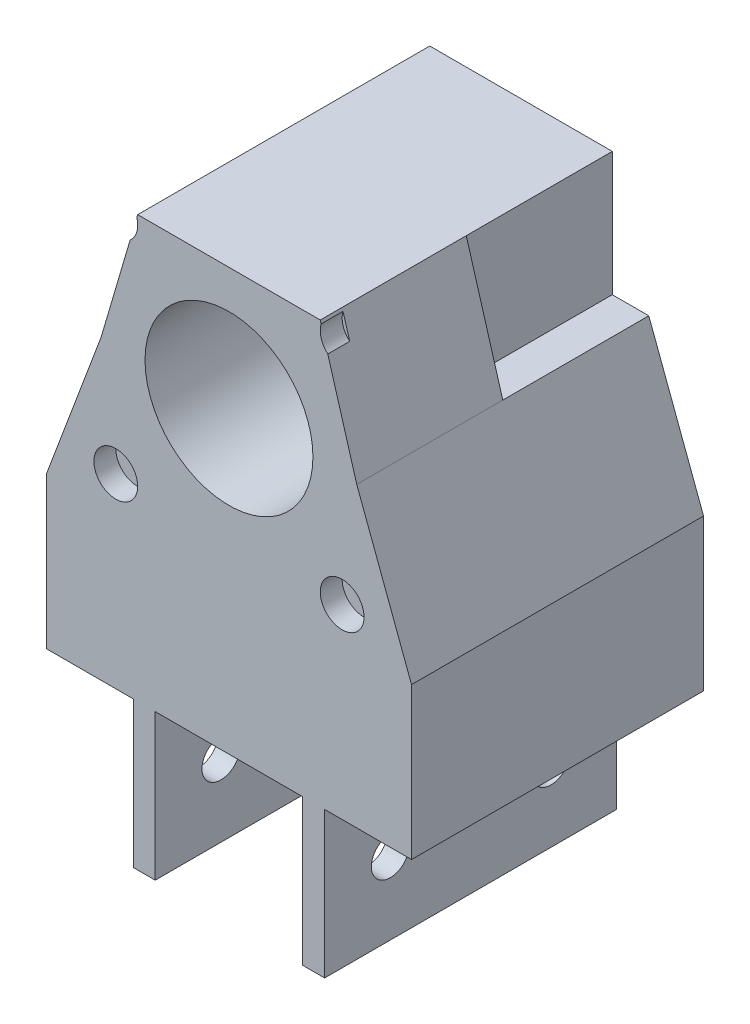
ISO-10303-21;
HEADER;
FILE_DESCRIPTION(('STEP AP214'),'2;1');
FILE_NAME('part.step','',(''),(''),'','','');
FILE_SCHEMA(('AUTOMOTIVE_DESIGN { 1 0 10303 214 1 1 1 1 }'));
ENDSEC;
DATA;
#1=APPLICATION_CONTEXT('core data for automotive mechanical design processes');
#2=APPLICATION_PROTOCOL_DEFINITION('international standard','automotive_design',2000,#1);
#3=PRODUCT_CONTEXT('',#1,'mechanical');
#4=PRODUCT('Part','Part','',(#3));
#5=PRODUCT_RELATED_PRODUCT_CATEGORY('part','',(#4));
#6=PRODUCT_DEFINITION_FORMATION('','',#4);
#7=PRODUCT_DEFINITION_CONTEXT('part definition',#1,'design');
#8=PRODUCT_DEFINITION('design','',#6,#7);
#9=PRODUCT_DEFINITION_SHAPE('','',#8);
#10=(LENGTH_UNIT() NAMED_UNIT(*) SI_UNIT(.MILLI.,.METRE.));
#11=(NAMED_UNIT(*) PLANE_ANGLE_UNIT() SI_UNIT($,.RADIAN.));
#12=(NAMED_UNIT(*) SI_UNIT($,.STERADIAN.) SOLID_ANGLE_UNIT());
#13=UNCERTAINTY_MEASURE_WITH_UNIT(LENGTH_MEASURE(1.E-05),#10,'distance_accuracy_value','');
#14=(GEOMETRIC_REPRESENTATION_CONTEXT(3) GLOBAL_UNCERTAINTY_ASSIGNED_CONTEXT((#13)) GLOBAL_UNIT_ASSIGNED_CONTEXT((#10,
#11,#12)) REPRESENTATION_CONTEXT('',''));
#15=CARTESIAN_POINT('',(0.,0.,0.));
#16=DIRECTION('',(0.,0.,1.));
#17=DIRECTION('',(1.,0.,0.));
#18=AXIS2_PLACEMENT_3D('',#15,#16,#17);
#19=CARTESIAN_POINT('',(12.5,5.375,93.2353266168247));
#20=DIRECTION('',(-1.,0.,0.));
#21=DIRECTION('',(0.,0.,1.));
#22=AXIS2_PLACEMENT_3D('',#19,#20,#21);
#23=PLANE('',#22);
#24=DIRECTION('',(0.,-1.,0.));
#25=VECTOR('',#24,1.);
#26=CARTESIAN_POINT('',(12.5,35.375,20.));
#27=LINE('',#26,#25);
#28=CARTESIAN_POINT('',(12.5,52.375,20.));
#29=VERTEX_POINT('',#28);
#30=CARTESIAN_POINT('',(12.5,35.375,20.));
#31=VERTEX_POINT('',#30);
#32=EDGE_CURVE('E265',#29,#31,#27,.T.);
#33=ORIENTED_EDGE('',*,*,#32,.T.);
#34=DIRECTION('',(0.,0.,1.));
#35=VECTOR('',#34,1.);
#36=CARTESIAN_POINT('',(12.5,35.375,-32.5));
#37=LINE('',#36,#35);
#38=CARTESIAN_POINT('',(12.5,35.375,0.));
#39=VERTEX_POINT('',#38);
#40=EDGE_CURVE('E300',#39,#31,#37,.T.);
#41=ORIENTED_EDGE('',*,*,#40,.F.);
#42=DIRECTION('',(0.,1.,0.));
#43=VECTOR('',#42,1.);
#44=CARTESIAN_POINT('',(12.5,5.375,0.));
#45=LINE('',#44,#43);
#46=CARTESIAN_POINT('',(12.5,52.375,0.));
#47=VERTEX_POINT('',#46);
#48=EDGE_CURVE('E323',#39,#47,#45,.T.);
#49=ORIENTED_EDGE('',*,*,#48,.T.);
#50=DIRECTION('',(0.,0.,-1.));
#51=VECTOR('',#50,1.);
#52=CARTESIAN_POINT('',(12.5,52.375,93.2353266168247));
#53=LINE('',#52,#51);
#54=EDGE_CURVE('E318',#29,#47,#53,.T.);
#55=ORIENTED_EDGE('',*,*,#54,.F.);
#56=EDGE_LOOP('',(#33,#41,#49,#55));
#57=FACE_BOUND('',#56,.T.);
#58=ADVANCED_FACE('F65',(#57),#23,.F.);
#59=CARTESIAN_POINT('',(12.5,35.375,-32.5));
#60=DIRECTION('',(0.,1.,0.));
#61=DIRECTION('',(0.,0.,1.));
#62=AXIS2_PLACEMENT_3D('',#59,#60,#61);
#63=PLANE('',#62);
#64=ORIENTED_EDGE('',*,*,#40,.T.);
#65=DIRECTION('',(1.,0.,0.));
#66=VECTOR('',#65,1.);
#67=CARTESIAN_POINT('',(17.5,35.375,20.));
#68=LINE('',#67,#66);
#69=CARTESIAN_POINT('',(17.5,35.375,20.));
#70=VERTEX_POINT('',#69);
#71=EDGE_CURVE('E268',#31,#70,#68,.T.);
#72=ORIENTED_EDGE('',*,*,#71,.T.);
#73=DIRECTION('',(0.,0.,1.));
#74=VECTOR('',#73,1.);
#75=CARTESIAN_POINT('',(17.5,35.375,-32.5));
#76=LINE('',#75,#74);
#77=CARTESIAN_POINT('',(17.5,35.375,0.));
#78=VERTEX_POINT('',#77);
#79=EDGE_CURVE('E308',#78,#70,#76,.T.);
#80=ORIENTED_EDGE('',*,*,#79,.F.);
#81=DIRECTION('',(1.,0.,0.));
#82=VECTOR('',#81,1.);
#83=CARTESIAN_POINT('',(12.5,35.375,0.));
#84=LINE('',#83,#82);
#85=EDGE_CURVE('E299',#39,#78,#84,.T.);
#86=ORIENTED_EDGE('',*,*,#85,.F.);
#87=EDGE_LOOP('',(#64,#72,#80,#86));
#88=FACE_BOUND('',#87,.T.);
#89=ADVANCED_FACE('F446',(#88),#63,.T.);
#90=CARTESIAN_POINT('',(13.1,0.,40.));
#91=DIRECTION('',(1.,0.,0.));
#92=DIRECTION('',(0.,1.,0.));
#93=AXIS2_PLACEMENT_3D('',#90,#91,#92);
#94=PLANE('',#93);
#95=CARTESIAN_POINT('',(13.1,-15.375,31.));
#96=DIRECTION('',(1.,0.,0.));
#97=DIRECTION('',(0.,0.,-1.));
#98=AXIS2_PLACEMENT_3D('',#95,#96,#97);
#99=CIRCLE('',#98,2.60000000000001);
#100=CARTESIAN_POINT('',(13.1,-15.375,28.4));
#101=VERTEX_POINT('',#100);
#102=EDGE_CURVE('E419',#101,#101,#99,.T.);
#103=ORIENTED_EDGE('',*,*,#102,.F.);
#104=EDGE_LOOP('',(#103));
#105=FACE_BOUND('',#104,.T.);
#106=CARTESIAN_POINT('',(13.1,-15.375,9.));
#107=DIRECTION('',(1.,0.,0.));
#108=DIRECTION('',(0.,0.,-1.));
#109=AXIS2_PLACEMENT_3D('',#106,#107,#108);
#110=CIRCLE('',#109,2.60000000000001);
#111=CARTESIAN_POINT('',(13.1,-15.375,6.39999999999999));
#112=VERTEX_POINT('',#111);
#113=EDGE_CURVE('E414',#112,#112,#110,.T.);
#114=ORIENTED_EDGE('',*,*,#113,.F.);
#115=EDGE_LOOP('',(#114));
#116=FACE_BOUND('',#115,.T.);
#117=DIRECTION('',(0.,-1.,0.));
#118=VECTOR('',#117,1.);
#119=CARTESIAN_POINT('',(13.1,0.,0.));
#120=LINE('',#119,#118);
#121=CARTESIAN_POINT('',(13.1,-5.375,0.));
#122=VERTEX_POINT('',#121);
#123=CARTESIAN_POINT('',(13.1,-25.375,0.));
#124=VERTEX_POINT('',#123);
#125=EDGE_CURVE('E329',#122,#124,#120,.T.);
#126=ORIENTED_EDGE('',*,*,#125,.F.);
#127=DIRECTION('',(0.,0.,-1.));
#128=VECTOR('',#127,1.);
#129=CARTESIAN_POINT('',(13.1,-5.375,40.));
#130=LINE('',#129,#128);
#131=CARTESIAN_POINT('',(13.1,-5.375,40.));
#132=VERTEX_POINT('',#131);
#133=EDGE_CURVE('E408',#132,#122,#130,.T.);
#134=ORIENTED_EDGE('',*,*,#133,.F.);
#135=DIRECTION('',(0.,-1.,0.));
#136=VECTOR('',#135,1.);
#137=CARTESIAN_POINT('',(13.1,0.,40.));
#138=LINE('',#137,#136);
#139=CARTESIAN_POINT('',(13.1,-25.375,40.));
#140=VERTEX_POINT('',#139);
#141=EDGE_CURVE('E336',#132,#140,#138,.T.);
#142=ORIENTED_EDGE('',*,*,#141,.T.);
#143=DIRECTION('',(0.,0.,-1.));
#144=VECTOR('',#143,1.);
#145=CARTESIAN_POINT('',(13.1,-25.375,40.));
#146=LINE('',#145,#144);
#147=EDGE_CURVE('E361',#140,#124,#146,.T.);
#148=ORIENTED_EDGE('',*,*,#147,.T.);
#149=EDGE_LOOP('',(#126,#134,#142,#148));
#150=FACE_BOUND('',#149,.T.);
#151=ADVANCED_FACE('F67',(#105,#116,#150),#94,.T.);
#152=CARTESIAN_POINT('',(0.,-5.375,40.));
#153=DIRECTION('',(0.,1.,0.));
#154=DIRECTION('',(0.,0.,1.));
#155=AXIS2_PLACEMENT_3D('',#152,#153,#154);
#156=PLANE('',#155);
#157=DIRECTION('',(1.,0.,0.));
#158=VECTOR('',#157,1.);
#159=CARTESIAN_POINT('',(0.,-5.375,0.));
#160=LINE('',#159,#158);
#161=CARTESIAN_POINT('',(25.,-5.375,0.));
#162=VERTEX_POINT('',#161);
#163=EDGE_CURVE('E364',#122,#162,#160,.T.);
#164=ORIENTED_EDGE('',*,*,#163,.T.);
#165=DIRECTION('',(0.,0.,-1.));
#166=VECTOR('',#165,1.);
#167=CARTESIAN_POINT('',(25.,-5.375,40.));
#168=LINE('',#167,#166);
#169=CARTESIAN_POINT('',(25.,-5.375,40.));
#170=VERTEX_POINT('',#169);
#171=EDGE_CURVE('E405',#170,#162,#168,.T.);
#172=ORIENTED_EDGE('',*,*,#171,.F.);
#173=DIRECTION('',(1.,0.,0.));
#174=VECTOR('',#173,1.);
#175=CARTESIAN_POINT('',(0.,-5.375,40.));
#176=LINE('',#175,#174);
#177=EDGE_CURVE('E339',#132,#170,#176,.T.);
#178=ORIENTED_EDGE('',*,*,#177,.F.);
#179=ORIENTED_EDGE('',*,*,#133,.T.);
#180=EDGE_LOOP('',(#164,#172,#178,#179));
#181=FACE_BOUND('',#180,.T.);
#182=ADVANCED_FACE('F499',(#181),#156,.F.);
#183=CARTESIAN_POINT('',(25.,0.,40.));
#184=DIRECTION('',(-1.,0.,0.));
#185=DIRECTION('',(0.,0.,1.));
#186=AXIS2_PLACEMENT_3D('',#183,#184,#185);
#187=PLANE('',#186);
#188=DIRECTION('',(0.,1.,0.));
#189=VECTOR('',#188,1.);
#190=CARTESIAN_POINT('',(25.,0.,0.));
#191=LINE('',#190,#189);
#192=CARTESIAN_POINT('',(25.,15.375,0.));
#193=VERTEX_POINT('',#192);
#194=EDGE_CURVE('E366',#162,#193,#191,.T.);
#195=ORIENTED_EDGE('',*,*,#194,.T.);
#196=DIRECTION('',(0.,0.,1.));
#197=VECTOR('',#196,1.);
#198=CARTESIAN_POINT('',(25.,15.375,-32.5));
#199=LINE('',#198,#197);
#200=CARTESIAN_POINT('',(25.,15.375,40.));
#201=VERTEX_POINT('',#200);
#202=EDGE_CURVE('E305',#193,#201,#199,.T.);
#203=ORIENTED_EDGE('',*,*,#202,.T.);
#204=DIRECTION('',(0.,1.,0.));
#205=VECTOR('',#204,1.);
#206=CARTESIAN_POINT('',(25.,0.,40.));
#207=LINE('',#206,#205);
#208=EDGE_CURVE('E342',#170,#201,#207,.T.);
#209=ORIENTED_EDGE('',*,*,#208,.F.);
#210=ORIENTED_EDGE('',*,*,#171,.T.);
#211=EDGE_LOOP('',(#195,#203,#209,#210));
#212=FACE_BOUND('',#211,.T.);
#213=ADVANCED_FACE('F496',(#212),#187,.F.);
#214=CARTESIAN_POINT('',(-25.,0.,40.));
#215=DIRECTION('',(-1.,0.,0.));
#216=DIRECTION('',(0.,0.,1.));
#217=AXIS2_PLACEMENT_3D('',#214,#215,#216);
#218=PLANE('',#217);
#219=DIRECTION('',(0.,1.,0.));
#220=VECTOR('',#219,1.);
#221=CARTESIAN_POINT('',(-25.,0.,0.));
#222=LINE('',#221,#220);
#223=CARTESIAN_POINT('',(-25.,-5.375,0.));
#224=VERTEX_POINT('',#223);
#225=CARTESIAN_POINT('',(-25.,15.375,0.));
#226=VERTEX_POINT('',#225);
#227=EDGE_CURVE('E368',#224,#226,#222,.T.);
#228=ORIENTED_EDGE('',*,*,#227,.F.);
#229=DIRECTION('',(0.,0.,-1.));
#230=VECTOR('',#229,1.);
#231=CARTESIAN_POINT('',(-25.,-5.375,40.));
#232=LINE('',#231,#230);
#233=CARTESIAN_POINT('',(-25.,-5.375,40.));
#234=VERTEX_POINT('',#233);
#235=EDGE_CURVE('E403',#234,#224,#232,.T.);
#236=ORIENTED_EDGE('',*,*,#235,.F.);
#237=DIRECTION('',(0.,1.,0.));
#238=VECTOR('',#237,1.);
#239=CARTESIAN_POINT('',(-25.,0.,40.));
#240=LINE('',#239,#238);
#241=CARTESIAN_POINT('',(-25.,15.375,40.));
#242=VERTEX_POINT('',#241);
#243=EDGE_CURVE('E344',#234,#242,#240,.T.);
#244=ORIENTED_EDGE('',*,*,#243,.T.);
#245=DIRECTION('',(0.,0.,1.));
#246=VECTOR('',#245,1.);
#247=CARTESIAN_POINT('',(-25.,15.375,-32.5));
#248=LINE('',#247,#246);
#249=EDGE_CURVE('E285',#226,#242,#248,.T.);
#250=ORIENTED_EDGE('',*,*,#249,.F.);
#251=EDGE_LOOP('',(#228,#236,#244,#250));
#252=FACE_BOUND('',#251,.T.);
#253=ADVANCED_FACE('F492',(#252),#218,.T.);
#254=CARTESIAN_POINT('',(0.,-5.375,40.));
#255=DIRECTION('',(0.,1.,0.));
#256=DIRECTION('',(0.,0.,1.));
#257=AXIS2_PLACEMENT_3D('',#254,#255,#256);
#258=PLANE('',#257);
#259=DIRECTION('',(1.,0.,0.));
#260=VECTOR('',#259,1.);
#261=CARTESIAN_POINT('',(0.,-5.375,0.));
#262=LINE('',#261,#260);
#263=CARTESIAN_POINT('',(-13.1,-5.375,0.));
#264=VERTEX_POINT('',#263);
#265=EDGE_CURVE('E370',#224,#264,#262,.T.);
#266=ORIENTED_EDGE('',*,*,#265,.T.);
#267=DIRECTION('',(0.,0.,-1.));
#268=VECTOR('',#267,1.);
#269=CARTESIAN_POINT('',(-13.1,-5.375,40.));
#270=LINE('',#269,#268);
#271=CARTESIAN_POINT('',(-13.1,-5.375,40.));
#272=VERTEX_POINT('',#271);
#273=EDGE_CURVE('E400',#272,#264,#270,.T.);
#274=ORIENTED_EDGE('',*,*,#273,.F.);
#275=DIRECTION('',(1.,0.,0.));
#276=VECTOR('',#275,1.);
#277=CARTESIAN_POINT('',(0.,-5.375,40.));
#278=LINE('',#277,#276);
#279=EDGE_CURVE('E346',#234,#272,#278,.T.);
#280=ORIENTED_EDGE('',*,*,#279,.F.);
#281=ORIENTED_EDGE('',*,*,#235,.T.);
#282=EDGE_LOOP('',(#266,#274,#280,#281));
#283=FACE_BOUND('',#282,.T.);
#284=ADVANCED_FACE('F488',(#283),#258,.F.);
#285=CARTESIAN_POINT('',(-13.1,0.,40.));
#286=DIRECTION('',(1.,0.,0.));
#287=DIRECTION('',(0.,1.,0.));
#288=AXIS2_PLACEMENT_3D('',#285,#286,#287);
#289=PLANE('',#288);
#290=CARTESIAN_POINT('',(-13.1,-15.375,31.));
#291=DIRECTION('',(1.,0.,0.));
#292=DIRECTION('',(0.,1.,0.));
#293=AXIS2_PLACEMENT_3D('',#290,#291,#292);
#294=CIRCLE('',#293,2.60000000000001);
#295=CARTESIAN_POINT('',(-13.1,-12.775,31.));
#296=VERTEX_POINT('',#295);
#297=EDGE_CURVE('E592',#296,#296,#294,.T.);
#298=ORIENTED_EDGE('',*,*,#297,.T.);
#299=EDGE_LOOP('',(#298));
#300=FACE_BOUND('',#299,.T.);
#301=CARTESIAN_POINT('',(-13.1,-15.375,9.));
#302=DIRECTION('',(1.,0.,0.));
#303=DIRECTION('',(0.,1.,0.));
#304=AXIS2_PLACEMENT_3D('',#301,#302,#303);
#305=CIRCLE('',#304,2.60000000000001);
#306=CARTESIAN_POINT('',(-13.1,-12.775,9.));
#307=VERTEX_POINT('',#306);
#308=EDGE_CURVE('E598',#307,#307,#305,.T.);
#309=ORIENTED_EDGE('',*,*,#308,.T.);
#310=EDGE_LOOP('',(#309));
#311=FACE_BOUND('',#310,.T.);
#312=DIRECTION('',(0.,-1.,0.));
#313=VECTOR('',#312,1.);
#314=CARTESIAN_POINT('',(-13.1,0.,0.));
#315=LINE('',#314,#313);
#316=CARTESIAN_POINT('',(-13.1,-25.375,0.));
#317=VERTEX_POINT('',#316);
#318=EDGE_CURVE('E372',#264,#317,#315,.T.);
#319=ORIENTED_EDGE('',*,*,#318,.T.);
#320=DIRECTION('',(0.,0.,-1.));
#321=VECTOR('',#320,1.);
#322=CARTESIAN_POINT('',(-13.1,-25.375,40.));
#323=LINE('',#322,#321);
#324=CARTESIAN_POINT('',(-13.1,-25.375,40.));
#325=VERTEX_POINT('',#324);
#326=EDGE_CURVE('E397',#325,#317,#323,.T.);
#327=ORIENTED_EDGE('',*,*,#326,.F.);
#328=DIRECTION('',(0.,-1.,0.));
#329=VECTOR('',#328,1.);
#330=CARTESIAN_POINT('',(-13.1,0.,40.));
#331=LINE('',#330,#329);
#332=EDGE_CURVE('E348',#272,#325,#331,.T.);
#333=ORIENTED_EDGE('',*,*,#332,.F.);
#334=ORIENTED_EDGE('',*,*,#273,.T.);
#335=EDGE_LOOP('',(#319,#327,#333,#334));
#336=FACE_BOUND('',#335,.T.);
#337=ADVANCED_FACE('F484',(#300,#311,#336),#289,.F.);
#338=CARTESIAN_POINT('',(0.,-25.375,40.));
#339=DIRECTION('',(0.,1.,0.));
#340=DIRECTION('',(0.,0.,1.));
#341=AXIS2_PLACEMENT_3D('',#338,#339,#340);
#342=PLANE('',#341);
#343=DIRECTION('',(1.,0.,0.));
#344=VECTOR('',#343,1.);
#345=CARTESIAN_POINT('',(0.,-25.375,0.));
#346=LINE('',#345,#344);
#347=CARTESIAN_POINT('',(-10.1,-25.375,0.));
#348=VERTEX_POINT('',#347);
#349=EDGE_CURVE('E374',#317,#348,#346,.T.);
#350=ORIENTED_EDGE('',*,*,#349,.T.);
#351=DIRECTION('',(0.,0.,-1.));
#352=VECTOR('',#351,1.);
#353=CARTESIAN_POINT('',(-10.1,-25.375,40.));
#354=LINE('',#353,#352);
#355=CARTESIAN_POINT('',(-10.1,-25.375,40.));
#356=VERTEX_POINT('',#355);
#357=EDGE_CURVE('E394',#356,#348,#354,.T.);
#358=ORIENTED_EDGE('',*,*,#357,.F.);
#359=DIRECTION('',(1.,0.,0.));
#360=VECTOR('',#359,1.);
#361=CARTESIAN_POINT('',(0.,-25.375,40.));
#362=LINE('',#361,#360);
#363=EDGE_CURVE('E350',#325,#356,#362,.T.);
#364=ORIENTED_EDGE('',*,*,#363,.F.);
#365=ORIENTED_EDGE('',*,*,#326,.T.);
#366=EDGE_LOOP('',(#350,#358,#364,#365));
#367=FACE_BOUND('',#366,.T.);
#368=ADVANCED_FACE('F480',(#367),#342,.F.);
#369=CARTESIAN_POINT('',(-10.1,0.,40.));
#370=DIRECTION('',(-1.,0.,0.));
#371=DIRECTION('',(0.,0.,1.));
#372=AXIS2_PLACEMENT_3D('',#369,#370,#371);
#373=PLANE('',#372);
#374=CARTESIAN_POINT('',(-10.1,-15.375,31.));
#375=DIRECTION('',(-1.,0.,0.));
#376=DIRECTION('',(0.,0.,1.));
#377=AXIS2_PLACEMENT_3D('',#374,#375,#376);
#378=CIRCLE('',#377,2.60000000000001);
#379=CARTESIAN_POINT('',(-10.1,-15.375,33.6));
#380=VERTEX_POINT('',#379);
#381=EDGE_CURVE('E415',#380,#380,#378,.T.);
#382=ORIENTED_EDGE('',*,*,#381,.T.);
#383=EDGE_LOOP('',(#382));
#384=FACE_BOUND('',#383,.T.);
#385=CARTESIAN_POINT('',(-10.1,-15.375,9.));
#386=DIRECTION('',(-1.,0.,0.));
#387=DIRECTION('',(0.,0.,1.));
#388=AXIS2_PLACEMENT_3D('',#385,#386,#387);
#389=CIRCLE('',#388,2.60000000000001);
#390=CARTESIAN_POINT('',(-10.1,-15.375,11.6));
#391=VERTEX_POINT('',#390);
#392=EDGE_CURVE('E413',#391,#391,#389,.T.);
#393=ORIENTED_EDGE('',*,*,#392,.T.);
#394=EDGE_LOOP('',(#393));
#395=FACE_BOUND('',#394,.T.);
#396=DIRECTION('',(0.,1.,0.));
#397=VECTOR('',#396,1.);
#398=CARTESIAN_POINT('',(-10.1,0.,0.));
#399=LINE('',#398,#397);
#400=CARTESIAN_POINT('',(-10.1,-5.375,0.));
#401=VERTEX_POINT('',#400);
#402=EDGE_CURVE('E376',#348,#401,#399,.T.);
#403=ORIENTED_EDGE('',*,*,#402,.T.);
#404=DIRECTION('',(0.,0.,-1.));
#405=VECTOR('',#404,1.);
#406=CARTESIAN_POINT('',(-10.1,-5.375,40.));
#407=LINE('',#406,#405);
#408=CARTESIAN_POINT('',(-10.1,-5.375,40.));
#409=VERTEX_POINT('',#408);
#410=EDGE_CURVE('E391',#409,#401,#407,.T.);
#411=ORIENTED_EDGE('',*,*,#410,.F.);
#412=DIRECTION('',(0.,1.,0.));
#413=VECTOR('',#412,1.);
#414=CARTESIAN_POINT('',(-10.1,0.,40.));
#415=LINE('',#414,#413);
#416=EDGE_CURVE('E352',#356,#409,#415,.T.);
#417=ORIENTED_EDGE('',*,*,#416,.F.);
#418=ORIENTED_EDGE('',*,*,#357,.T.);
#419=EDGE_LOOP('',(#403,#411,#417,#418));
#420=FACE_BOUND('',#419,.T.);
#421=ADVANCED_FACE('F476',(#384,#395,#420),#373,.F.);
#422=CARTESIAN_POINT('',(0.,-5.375,40.));
#423=DIRECTION('',(0.,1.,0.));
#424=DIRECTION('',(0.,0.,1.));
#425=AXIS2_PLACEMENT_3D('',#422,#423,#424);
#426=PLANE('',#425);
#427=DIRECTION('',(1.,0.,0.));
#428=VECTOR('',#427,1.);
#429=CARTESIAN_POINT('',(0.,-5.375,0.));
#430=LINE('',#429,#428);
#431=CARTESIAN_POINT('',(10.1,-5.375,0.));
#432=VERTEX_POINT('',#431);
#433=EDGE_CURVE('E378',#401,#432,#430,.T.);
#434=ORIENTED_EDGE('',*,*,#433,.T.);
#435=DIRECTION('',(0.,0.,-1.));
#436=VECTOR('',#435,1.);
#437=CARTESIAN_POINT('',(10.1,-5.375,40.));
#438=LINE('',#437,#436);
#439=CARTESIAN_POINT('',(10.1,-5.375,40.));
#440=VERTEX_POINT('',#439);
#441=EDGE_CURVE('E389',#440,#432,#438,.T.);
#442=ORIENTED_EDGE('',*,*,#441,.F.);
#443=DIRECTION('',(1.,0.,0.));
#444=VECTOR('',#443,1.);
#445=CARTESIAN_POINT('',(0.,-5.375,40.));
#446=LINE('',#445,#444);
#447=EDGE_CURVE('E354',#409,#440,#446,.T.);
#448=ORIENTED_EDGE('',*,*,#447,.F.);
#449=ORIENTED_EDGE('',*,*,#410,.T.);
#450=EDGE_LOOP('',(#434,#442,#448,#449));
#451=FACE_BOUND('',#450,.T.);
#452=ADVANCED_FACE('F472',(#451),#426,.F.);
#453=CARTESIAN_POINT('',(10.1,0.,40.));
#454=DIRECTION('',(-1.,0.,0.));
#455=DIRECTION('',(0.,0.,1.));
#456=AXIS2_PLACEMENT_3D('',#453,#454,#455);
#457=PLANE('',#456);
#458=CARTESIAN_POINT('',(10.1,-15.375,31.));
#459=DIRECTION('',(-1.,0.,0.));
#460=DIRECTION('',(0.,0.,1.));
#461=AXIS2_PLACEMENT_3D('',#458,#459,#460);
#462=CIRCLE('',#461,2.60000000000001);
#463=CARTESIAN_POINT('',(10.1,-15.375,33.6));
#464=VERTEX_POINT('',#463);
#465=EDGE_CURVE('E418',#464,#464,#462,.T.);
#466=ORIENTED_EDGE('',*,*,#465,.F.);
#467=EDGE_LOOP('',(#466));
#468=FACE_BOUND('',#467,.T.);
#469=CARTESIAN_POINT('',(10.1,-15.375,9.));
#470=DIRECTION('',(-1.,0.,0.));
#471=DIRECTION('',(0.,0.,1.));
#472=AXIS2_PLACEMENT_3D('',#469,#470,#471);
#473=CIRCLE('',#472,2.60000000000001);
#474=CARTESIAN_POINT('',(10.1,-15.375,11.6));
#475=VERTEX_POINT('',#474);
#476=EDGE_CURVE('E410',#475,#475,#473,.T.);
#477=ORIENTED_EDGE('',*,*,#476,.F.);
#478=EDGE_LOOP('',(#477));
#479=FACE_BOUND('',#478,.T.);
#480=DIRECTION('',(0.,1.,0.));
#481=VECTOR('',#480,1.);
#482=CARTESIAN_POINT('',(10.1,0.,0.));
#483=LINE('',#482,#481);
#484=CARTESIAN_POINT('',(10.1,-25.375,0.));
#485=VERTEX_POINT('',#484);
#486=EDGE_CURVE('E381',#485,#432,#483,.T.);
#487=ORIENTED_EDGE('',*,*,#486,.F.);
#488=DIRECTION('',(0.,0.,-1.));
#489=VECTOR('',#488,1.);
#490=CARTESIAN_POINT('',(10.1,-25.375,40.));
#491=LINE('',#490,#489);
#492=CARTESIAN_POINT('',(10.1,-25.375,40.));
#493=VERTEX_POINT('',#492);
#494=EDGE_CURVE('E387',#493,#485,#491,.T.);
#495=ORIENTED_EDGE('',*,*,#494,.F.);
#496=DIRECTION('',(0.,1.,0.));
#497=VECTOR('',#496,1.);
#498=CARTESIAN_POINT('',(10.1,0.,40.));
#499=LINE('',#498,#497);
#500=EDGE_CURVE('E356',#493,#440,#499,.T.);
#501=ORIENTED_EDGE('',*,*,#500,.T.);
#502=ORIENTED_EDGE('',*,*,#441,.T.);
#503=EDGE_LOOP('',(#487,#495,#501,#502));
#504=FACE_BOUND('',#503,.T.);
#505=ADVANCED_FACE('F468',(#468,#479,#504),#457,.T.);
#506=CARTESIAN_POINT('',(0.,-25.375,40.));
#507=DIRECTION('',(0.,1.,0.));
#508=DIRECTION('',(0.,0.,1.));
#509=AXIS2_PLACEMENT_3D('',#506,#507,#508);
#510=PLANE('',#509);
#511=DIRECTION('',(1.,0.,0.));
#512=VECTOR('',#511,1.);
#513=CARTESIAN_POINT('',(0.,-25.375,0.));
#514=LINE('',#513,#512);
#515=EDGE_CURVE('E340',#485,#124,#514,.T.);
#516=ORIENTED_EDGE('',*,*,#515,.T.);
#517=ORIENTED_EDGE('',*,*,#147,.F.);
#518=DIRECTION('',(1.,0.,0.));
#519=VECTOR('',#518,1.);
#520=CARTESIAN_POINT('',(0.,-25.375,40.));
#521=LINE('',#520,#519);
#522=EDGE_CURVE('E359',#493,#140,#521,.T.);
#523=ORIENTED_EDGE('',*,*,#522,.F.);
#524=ORIENTED_EDGE('',*,*,#494,.T.);
#525=EDGE_LOOP('',(#516,#517,#523,#524));
#526=FACE_BOUND('',#525,.T.);
#527=ADVANCED_FACE('F461',(#526),#510,.F.);
#528=CARTESIAN_POINT('',(0.,0.,40.));
#529=DIRECTION('',(0.,0.,1.));
#530=DIRECTION('',(1.,0.,0.));
#531=AXIS2_PLACEMENT_3D('',#528,#529,#530);
#532=PLANE('',#531);
#533=CARTESIAN_POINT('',(15.4999999999999,51.125,40.));
#534=DIRECTION('',(0.,0.,1.));
#535=DIRECTION('',(1.,0.,0.));
#536=AXIS2_PLACEMENT_3D('',#533,#534,#535);
#537=CIRCLE('',#536,3.);
#538=CARTESIAN_POINT('',(12.6202929823547,51.966003859994,40.));
#539=VERTEX_POINT('',#538);
#540=CARTESIAN_POINT('',(13.5341656163714,48.8588369043372,40.));
#541=VERTEX_POINT('',#540);
#542=EDGE_CURVE('E234',#539,#541,#537,.T.);
#543=ORIENTED_EDGE('',*,*,#542,.F.);
#544=DIRECTION('',(-0.28216632399155,0.959365501571271,0.));
#545=VECTOR('',#544,1.);
#546=CARTESIAN_POINT('',(12.5,52.375,40.));
#547=LINE('',#546,#545);
#548=CARTESIAN_POINT('',(12.5,52.375,40.));
#549=VERTEX_POINT('',#548);
#550=EDGE_CURVE('E249',#539,#549,#547,.T.);
#551=ORIENTED_EDGE('',*,*,#550,.T.);
#552=DIRECTION('',(-1.,0.,0.));
#553=VECTOR('',#552,1.);
#554=CARTESIAN_POINT('',(0.,52.375,40.));
#555=LINE('',#554,#553);
#556=CARTESIAN_POINT('',(-12.5,52.375,40.));
#557=VERTEX_POINT('',#556);
#558=EDGE_CURVE('E248',#549,#557,#555,.T.);
#559=ORIENTED_EDGE('',*,*,#558,.T.);
#560=DIRECTION('',(-0.28216632399155,-0.959365501571271,0.));
#561=VECTOR('',#560,1.);
#562=CARTESIAN_POINT('',(-12.5,52.375,40.));
#563=LINE('',#562,#561);
#564=CARTESIAN_POINT('',(-12.6202929823548,51.9660038599938,40.));
#565=VERTEX_POINT('',#564);
#566=EDGE_CURVE('E240',#557,#565,#563,.T.);
#567=ORIENTED_EDGE('',*,*,#566,.T.);
#568=CARTESIAN_POINT('',(-15.5000000000001,51.125,40.));
#569=DIRECTION('',(0.,0.,1.));
#570=DIRECTION('',(1.,0.,0.));
#571=AXIS2_PLACEMENT_3D('',#568,#569,#570);
#572=CIRCLE('',#571,3.);
#573=CARTESIAN_POINT('',(-13.5341656163714,48.8588369043374,40.));
#574=VERTEX_POINT('',#573);
#575=EDGE_CURVE('E224',#574,#565,#572,.T.);
#576=ORIENTED_EDGE('',*,*,#575,.F.);
#577=CARTESIAN_POINT('',(-17.5,35.375,40.));
#578=VERTEX_POINT('',#577);
#579=EDGE_CURVE('E250',#574,#578,#563,.T.);
#580=ORIENTED_EDGE('',*,*,#579,.T.);
#581=DIRECTION('',(-0.351123441588392,-0.936329177569044,0.));
#582=VECTOR('',#581,1.);
#583=CARTESIAN_POINT('',(-17.5,35.375,40.));
#584=LINE('',#583,#582);
#585=EDGE_CURVE('E284',#578,#242,#584,.T.);
#586=ORIENTED_EDGE('',*,*,#585,.T.);
#587=ORIENTED_EDGE('',*,*,#243,.F.);
#588=ORIENTED_EDGE('',*,*,#279,.T.);
#589=ORIENTED_EDGE('',*,*,#332,.T.);
#590=ORIENTED_EDGE('',*,*,#363,.T.);
#591=ORIENTED_EDGE('',*,*,#416,.T.);
#592=ORIENTED_EDGE('',*,*,#447,.T.);
#593=ORIENTED_EDGE('',*,*,#500,.F.);
#594=ORIENTED_EDGE('',*,*,#522,.T.);
#595=ORIENTED_EDGE('',*,*,#141,.F.);
#596=ORIENTED_EDGE('',*,*,#177,.T.);
#597=ORIENTED_EDGE('',*,*,#208,.T.);
#598=DIRECTION('',(-0.351123441588392,0.936329177569044,0.));
#599=VECTOR('',#598,1.);
#600=CARTESIAN_POINT('',(17.5,35.375,40.));
#601=LINE('',#600,#599);
#602=CARTESIAN_POINT('',(17.5,35.375,40.));
#603=VERTEX_POINT('',#602);
#604=EDGE_CURVE('E293',#201,#603,#601,.T.);
#605=ORIENTED_EDGE('',*,*,#604,.T.);
#606=EDGE_CURVE('E252',#603,#541,#547,.T.);
#607=ORIENTED_EDGE('',*,*,#606,.T.);
#608=EDGE_LOOP('',(#543,#551,#559,#567,#576,#580,#586,#587,#588,#589,#590,#591,#592,#593,#594,
#595,#596,#597,#605,#607));
#609=FACE_BOUND('',#608,.T.);
#610=CARTESIAN_POINT('',(-15.5000000000001,20.125,40.));
#611=DIRECTION('',(0.,0.,1.));
#612=DIRECTION('',(1.,0.,0.));
#613=AXIS2_PLACEMENT_3D('',#610,#611,#612);
#614=CIRCLE('',#613,3.);
#615=CARTESIAN_POINT('',(-12.5000000000001,20.125,40.));
#616=VERTEX_POINT('',#615);
#617=EDGE_CURVE('E575',#616,#616,#614,.T.);
#618=ORIENTED_EDGE('',*,*,#617,.F.);
#619=EDGE_LOOP('',(#618));
#620=FACE_BOUND('',#619,.T.);
#621=CARTESIAN_POINT('',(15.5,20.125,40.));
#622=DIRECTION('',(0.,0.,1.));
#623=DIRECTION('',(1.,0.,0.));
#624=AXIS2_PLACEMENT_3D('',#621,#622,#623);
#625=CIRCLE('',#624,3.);
#626=CARTESIAN_POINT('',(18.5,20.125,40.));
#627=VERTEX_POINT('',#626);
#628=EDGE_CURVE('E586',#627,#627,#625,.T.);
#629=ORIENTED_EDGE('',*,*,#628,.F.);
#630=EDGE_LOOP('',(#629));
#631=FACE_BOUND('',#630,.T.);
#632=CARTESIAN_POINT('',(0.,35.625,40.));
#633=DIRECTION('',(0.,0.,1.));
#634=DIRECTION('',(1.,0.,0.));
#635=AXIS2_PLACEMENT_3D('',#632,#633,#634);
#636=CIRCLE('',#635,11.5);
#637=CARTESIAN_POINT('',(11.5,35.625,40.));
#638=VERTEX_POINT('',#637);
#639=EDGE_CURVE('E302',#638,#638,#636,.T.);
#640=ORIENTED_EDGE('',*,*,#639,.F.);
#641=EDGE_LOOP('',(#640));
#642=FACE_BOUND('',#641,.T.);
#643=ADVANCED_FACE('F245',(#609,#620,#631,#642),#532,.T.);
#644=CARTESIAN_POINT('',(0.,0.,0.));
#645=DIRECTION('',(0.,0.,1.));
#646=DIRECTION('',(1.,0.,0.));
#647=AXIS2_PLACEMENT_3D('',#644,#645,#646);
#648=PLANE('',#647);
#649=DIRECTION('',(0.351123441588392,-0.936329177569045,0.));
#650=VECTOR('',#649,1.);
#651=CARTESIAN_POINT('',(17.5,35.375,0.));
#652=LINE('',#651,#650);
#653=EDGE_CURVE('E296',#78,#193,#652,.T.);
#654=ORIENTED_EDGE('',*,*,#653,.T.);
#655=ORIENTED_EDGE('',*,*,#194,.F.);
#656=ORIENTED_EDGE('',*,*,#163,.F.);
#657=ORIENTED_EDGE('',*,*,#125,.T.);
#658=ORIENTED_EDGE('',*,*,#515,.F.);
#659=ORIENTED_EDGE('',*,*,#486,.T.);
#660=ORIENTED_EDGE('',*,*,#433,.F.);
#661=ORIENTED_EDGE('',*,*,#402,.F.);
#662=ORIENTED_EDGE('',*,*,#349,.F.);
#663=ORIENTED_EDGE('',*,*,#318,.F.);
#664=ORIENTED_EDGE('',*,*,#265,.F.);
#665=ORIENTED_EDGE('',*,*,#227,.T.);
#666=DIRECTION('',(0.351123441588392,0.936329177569045,0.));
#667=VECTOR('',#666,1.);
#668=CARTESIAN_POINT('',(-17.5,35.375,0.));
#669=LINE('',#668,#667);
#670=CARTESIAN_POINT('',(-17.5,35.375,0.));
#671=VERTEX_POINT('',#670);
#672=EDGE_CURVE('E278',#226,#671,#669,.T.);
#673=ORIENTED_EDGE('',*,*,#672,.T.);
#674=DIRECTION('',(1.,0.,0.));
#675=VECTOR('',#674,1.);
#676=CARTESIAN_POINT('',(-12.5,35.375,0.));
#677=LINE('',#676,#675);
#678=CARTESIAN_POINT('',(-12.5,35.375,0.));
#679=VERTEX_POINT('',#678);
#680=EDGE_CURVE('E280',#671,#679,#677,.T.);
#681=ORIENTED_EDGE('',*,*,#680,.T.);
#682=DIRECTION('',(0.,1.,0.));
#683=VECTOR('',#682,1.);
#684=CARTESIAN_POINT('',(-12.5,0.,0.));
#685=LINE('',#684,#683);
#686=CARTESIAN_POINT('',(-12.5,52.375,0.));
#687=VERTEX_POINT('',#686);
#688=EDGE_CURVE('E324',#679,#687,#685,.T.);
#689=ORIENTED_EDGE('',*,*,#688,.T.);
#690=DIRECTION('',(-1.,0.,0.));
#691=VECTOR('',#690,1.);
#692=CARTESIAN_POINT('',(0.,52.375,0.));
#693=LINE('',#692,#691);
#694=EDGE_CURVE('E319',#47,#687,#693,.T.);
#695=ORIENTED_EDGE('',*,*,#694,.F.);
#696=ORIENTED_EDGE('',*,*,#48,.F.);
#697=ORIENTED_EDGE('',*,*,#85,.T.);
#698=EDGE_LOOP('',(#654,#655,#656,#657,#658,#659,#660,#661,#662,#663,#664,#665,#673,#681,#689,
#695,#696,#697));
#699=FACE_BOUND('',#698,.T.);
#700=CARTESIAN_POINT('',(0.,35.625,0.));
#701=DIRECTION('',(0.,0.,1.));
#702=DIRECTION('',(1.,0.,0.));
#703=AXIS2_PLACEMENT_3D('',#700,#701,#702);
#704=CIRCLE('',#703,11.5);
#705=CARTESIAN_POINT('',(11.5,35.625,0.));
#706=VERTEX_POINT('',#705);
#707=EDGE_CURVE('E315',#706,#706,#704,.T.);
#708=ORIENTED_EDGE('',*,*,#707,.T.);
#709=EDGE_LOOP('',(#708));
#710=FACE_BOUND('',#709,.T.);
#711=ADVANCED_FACE('F460',(#699,#710),#648,.F.);
#712=CARTESIAN_POINT('',(-12.5,0.,93.2353266168247));
#713=DIRECTION('',(-1.,0.,0.));
#714=DIRECTION('',(0.,0.,1.));
#715=AXIS2_PLACEMENT_3D('',#712,#713,#714);
#716=PLANE('',#715);
#717=DIRECTION('',(0.,1.,0.));
#718=VECTOR('',#717,1.);
#719=CARTESIAN_POINT('',(-12.5,35.375,20.));
#720=LINE('',#719,#718);
#721=CARTESIAN_POINT('',(-12.5,35.375,20.));
#722=VERTEX_POINT('',#721);
#723=CARTESIAN_POINT('',(-12.5,52.375,20.));
#724=VERTEX_POINT('',#723);
#725=EDGE_CURVE('E254',#722,#724,#720,.T.);
#726=ORIENTED_EDGE('',*,*,#725,.T.);
#727=DIRECTION('',(0.,0.,-1.));
#728=VECTOR('',#727,1.);
#729=CARTESIAN_POINT('',(-12.5,52.375,93.2353266168247));
#730=LINE('',#729,#728);
#731=EDGE_CURVE('E322',#724,#687,#730,.T.);
#732=ORIENTED_EDGE('',*,*,#731,.T.);
#733=ORIENTED_EDGE('',*,*,#688,.F.);
#734=DIRECTION('',(0.,0.,1.));
#735=VECTOR('',#734,1.);
#736=CARTESIAN_POINT('',(-12.5,35.375,-32.5));
#737=LINE('',#736,#735);
#738=EDGE_CURVE('E288',#679,#722,#737,.T.);
#739=ORIENTED_EDGE('',*,*,#738,.T.);
#740=EDGE_LOOP('',(#726,#732,#733,#739));
#741=FACE_BOUND('',#740,.T.);
#742=ADVANCED_FACE('F464',(#741),#716,.T.);
#743=CARTESIAN_POINT('',(0.,52.375,93.2353266168247));
#744=DIRECTION('',(0.,-1.,0.));
#745=DIRECTION('',(0.,0.,-1.));
#746=AXIS2_PLACEMENT_3D('',#743,#744,#745);
#747=PLANE('',#746);
#748=ORIENTED_EDGE('',*,*,#558,.F.);
#749=EDGE_CURVE('E333',#549,#29,#53,.T.);
#750=ORIENTED_EDGE('',*,*,#749,.T.);
#751=ORIENTED_EDGE('',*,*,#54,.T.);
#752=ORIENTED_EDGE('',*,*,#694,.T.);
#753=ORIENTED_EDGE('',*,*,#731,.F.);
#754=EDGE_CURVE('E327',#557,#724,#730,.T.);
#755=ORIENTED_EDGE('',*,*,#754,.F.);
#756=EDGE_LOOP('',(#748,#750,#751,#752,#753,#755));
#757=FACE_BOUND('',#756,.T.);
#758=ADVANCED_FACE('F456',(#757),#747,.F.);
#759=CARTESIAN_POINT('',(0.,35.625,40.));
#760=DIRECTION('',(0.,0.,1.));
#761=DIRECTION('',(1.,0.,0.));
#762=AXIS2_PLACEMENT_3D('',#759,#760,#761);
#763=CYLINDRICAL_SURFACE('',#762,11.5);
#764=ORIENTED_EDGE('',*,*,#707,.F.);
#765=EDGE_LOOP('',(#764));
#766=FACE_BOUND('',#765,.T.);
#767=ORIENTED_EDGE('',*,*,#639,.T.);
#768=EDGE_LOOP('',(#767));
#769=FACE_BOUND('',#768,.T.);
#770=ADVANCED_FACE('F634',(#766,#769),#763,.F.);
#771=CARTESIAN_POINT('',(17.5,35.375,-32.5));
#772=DIRECTION('',(0.936329177569045,0.351123441588392,0.));
#773=DIRECTION('',(-0.351123441588392,0.936329177569045,0.));
#774=AXIS2_PLACEMENT_3D('',#771,#772,#773);
#775=PLANE('',#774);
#776=ORIENTED_EDGE('',*,*,#653,.F.);
#777=ORIENTED_EDGE('',*,*,#79,.T.);
#778=DIRECTION('',(0.,0.,1.));
#779=VECTOR('',#778,1.);
#780=CARTESIAN_POINT('',(17.5,35.375,20.));
#781=LINE('',#780,#779);
#782=EDGE_CURVE('E273',#70,#603,#781,.T.);
#783=ORIENTED_EDGE('',*,*,#782,.T.);
#784=ORIENTED_EDGE('',*,*,#604,.F.);
#785=ORIENTED_EDGE('',*,*,#202,.F.);
#786=EDGE_LOOP('',(#776,#777,#783,#784,#785));
#787=FACE_BOUND('',#786,.T.);
#788=ADVANCED_FACE('F520',(#787),#775,.T.);
#789=CARTESIAN_POINT('',(-12.5,35.375,-32.5));
#790=DIRECTION('',(0.,1.,0.));
#791=DIRECTION('',(0.,0.,1.));
#792=AXIS2_PLACEMENT_3D('',#789,#790,#791);
#793=PLANE('',#792);
#794=DIRECTION('',(1.,0.,0.));
#795=VECTOR('',#794,1.);
#796=CARTESIAN_POINT('',(-17.5,35.375,20.));
#797=LINE('',#796,#795);
#798=CARTESIAN_POINT('',(-17.5,35.375,20.));
#799=VERTEX_POINT('',#798);
#800=EDGE_CURVE('E259',#799,#722,#797,.T.);
#801=ORIENTED_EDGE('',*,*,#800,.T.);
#802=ORIENTED_EDGE('',*,*,#738,.F.);
#803=ORIENTED_EDGE('',*,*,#680,.F.);
#804=DIRECTION('',(0.,0.,1.));
#805=VECTOR('',#804,1.);
#806=CARTESIAN_POINT('',(-17.5,35.375,-32.5));
#807=LINE('',#806,#805);
#808=EDGE_CURVE('E281',#671,#799,#807,.T.);
#809=ORIENTED_EDGE('',*,*,#808,.T.);
#810=EDGE_LOOP('',(#801,#802,#803,#809));
#811=FACE_BOUND('',#810,.T.);
#812=ADVANCED_FACE('F557',(#811),#793,.T.);
#813=CARTESIAN_POINT('',(-17.5,35.375,-32.5));
#814=DIRECTION('',(-0.936329177569045,0.351123441588392,0.));
#815=DIRECTION('',(-0.351123441588392,-0.936329177569045,0.));
#816=AXIS2_PLACEMENT_3D('',#813,#814,#815);
#817=PLANE('',#816);
#818=ORIENTED_EDGE('',*,*,#672,.F.);
#819=ORIENTED_EDGE('',*,*,#249,.T.);
#820=ORIENTED_EDGE('',*,*,#585,.F.);
#821=DIRECTION('',(0.,0.,1.));
#822=VECTOR('',#821,1.);
#823=CARTESIAN_POINT('',(-17.5,35.375,20.));
#824=LINE('',#823,#822);
#825=EDGE_CURVE('E257',#799,#578,#824,.T.);
#826=ORIENTED_EDGE('',*,*,#825,.F.);
#827=ORIENTED_EDGE('',*,*,#808,.F.);
#828=EDGE_LOOP('',(#818,#819,#820,#826,#827));
#829=FACE_BOUND('',#828,.T.);
#830=ADVANCED_FACE('F553',(#829),#817,.T.);
#831=CARTESIAN_POINT('',(12.5,52.375,20.));
#832=DIRECTION('',(0.959365501571271,0.28216632399155,0.));
#833=DIRECTION('',(-0.28216632399155,0.959365501571271,0.));
#834=AXIS2_PLACEMENT_3D('',#831,#832,#833);
#835=PLANE('',#834);
#836=DIRECTION('',(0.,0.,1.));
#837=VECTOR('',#836,1.);
#838=CARTESIAN_POINT('',(12.6202929823547,51.966003859994,37.));
#839=LINE('',#838,#837);
#840=CARTESIAN_POINT('',(12.6202929823547,51.966003859994,37.));
#841=VERTEX_POINT('',#840);
#842=EDGE_CURVE('E12',#841,#539,#839,.T.);
#843=ORIENTED_EDGE('',*,*,#842,.F.);
#844=DIRECTION('',(0.28216632399155,-0.959365501571271,0.));
#845=VECTOR('',#844,1.);
#846=CARTESIAN_POINT('',(12.5,52.375,37.));
#847=LINE('',#846,#845);
#848=CARTESIAN_POINT('',(13.5341656163714,48.8588369043372,37.));
#849=VERTEX_POINT('',#848);
#850=EDGE_CURVE('E422',#841,#849,#847,.T.);
#851=ORIENTED_EDGE('',*,*,#850,.T.);
#852=DIRECTION('',(0.,0.,1.));
#853=VECTOR('',#852,1.);
#854=CARTESIAN_POINT('',(13.5341656163714,48.8588369043372,37.));
#855=LINE('',#854,#853);
#856=EDGE_CURVE('E73',#541,#849,#855,.F.);
#857=ORIENTED_EDGE('',*,*,#856,.F.);
#858=ORIENTED_EDGE('',*,*,#606,.F.);
#859=ORIENTED_EDGE('',*,*,#782,.F.);
#860=DIRECTION('',(-0.28216632399155,0.959365501571271,0.));
#861=VECTOR('',#860,1.);
#862=CARTESIAN_POINT('',(12.5,52.375,20.));
#863=LINE('',#862,#861);
#864=EDGE_CURVE('E271',#70,#29,#863,.T.);
#865=ORIENTED_EDGE('',*,*,#864,.T.);
#866=ORIENTED_EDGE('',*,*,#749,.F.);
#867=ORIENTED_EDGE('',*,*,#550,.F.);
#868=EDGE_LOOP('',(#843,#851,#857,#858,#859,#865,#866,#867));
#869=FACE_BOUND('',#868,.T.);
#870=ADVANCED_FACE('F429',(#869),#835,.T.);
#871=CARTESIAN_POINT('',(0.,0.,20.));
#872=DIRECTION('',(0.,0.,1.));
#873=DIRECTION('',(1.,0.,0.));
#874=AXIS2_PLACEMENT_3D('',#871,#872,#873);
#875=PLANE('',#874);
#876=ORIENTED_EDGE('',*,*,#32,.F.);
#877=ORIENTED_EDGE('',*,*,#864,.F.);
#878=ORIENTED_EDGE('',*,*,#71,.F.);
#879=EDGE_LOOP('',(#876,#877,#878));
#880=FACE_BOUND('',#879,.T.);
#881=ADVANCED_FACE('F572',(#880),#875,.F.);
#882=CARTESIAN_POINT('',(-12.5,52.375,20.));
#883=DIRECTION('',(-0.959365501571271,0.28216632399155,0.));
#884=DIRECTION('',(-0.28216632399155,-0.959365501571271,0.));
#885=AXIS2_PLACEMENT_3D('',#882,#883,#884);
#886=PLANE('',#885);
#887=DIRECTION('',(0.,0.,1.));
#888=VECTOR('',#887,1.);
#889=CARTESIAN_POINT('',(-13.5341656163714,48.8588369043374,37.));
#890=LINE('',#889,#888);
#891=CARTESIAN_POINT('',(-13.5341656163714,48.8588369043374,37.));
#892=VERTEX_POINT('',#891);
#893=EDGE_CURVE('E230',#892,#574,#890,.T.);
#894=ORIENTED_EDGE('',*,*,#893,.F.);
#895=DIRECTION('',(0.28216632399155,0.959365501571271,0.));
#896=VECTOR('',#895,1.);
#897=CARTESIAN_POINT('',(-12.5,52.375,37.));
#898=LINE('',#897,#896);
#899=CARTESIAN_POINT('',(-12.6202929823548,51.9660038599938,37.));
#900=VERTEX_POINT('',#899);
#901=EDGE_CURVE('E241',#892,#900,#898,.T.);
#902=ORIENTED_EDGE('',*,*,#901,.T.);
#903=DIRECTION('',(0.,0.,1.));
#904=VECTOR('',#903,1.);
#905=CARTESIAN_POINT('',(-12.6202929823548,51.9660038599938,37.));
#906=LINE('',#905,#904);
#907=EDGE_CURVE('E227',#565,#900,#906,.F.);
#908=ORIENTED_EDGE('',*,*,#907,.F.);
#909=ORIENTED_EDGE('',*,*,#566,.F.);
#910=ORIENTED_EDGE('',*,*,#754,.T.);
#911=DIRECTION('',(-0.28216632399155,-0.959365501571271,0.));
#912=VECTOR('',#911,1.);
#913=CARTESIAN_POINT('',(-12.5,52.375,20.));
#914=LINE('',#913,#912);
#915=EDGE_CURVE('E261',#724,#799,#914,.T.);
#916=ORIENTED_EDGE('',*,*,#915,.T.);
#917=ORIENTED_EDGE('',*,*,#825,.T.);
#918=ORIENTED_EDGE('',*,*,#579,.F.);
#919=EDGE_LOOP('',(#894,#902,#908,#909,#910,#916,#917,#918));
#920=FACE_BOUND('',#919,.T.);
#921=ADVANCED_FACE('F238',(#920),#886,.T.);
#922=CARTESIAN_POINT('',(0.,0.,20.));
#923=DIRECTION('',(0.,0.,-1.));
#924=DIRECTION('',(-1.,0.,0.));
#925=AXIS2_PLACEMENT_3D('',#922,#923,#924);
#926=PLANE('',#925);
#927=ORIENTED_EDGE('',*,*,#725,.F.);
#928=ORIENTED_EDGE('',*,*,#800,.F.);
#929=ORIENTED_EDGE('',*,*,#915,.F.);
#930=EDGE_LOOP('',(#927,#928,#929));
#931=FACE_BOUND('',#930,.T.);
#932=ADVANCED_FACE('F564',(#931),#926,.T.);
#933=CARTESIAN_POINT('',(13.1,-15.375,9.));
#934=DIRECTION('',(1.,0.,0.));
#935=DIRECTION('',(0.,0.,-1.));
#936=AXIS2_PLACEMENT_3D('',#933,#934,#935);
#937=CYLINDRICAL_SURFACE('',#936,2.60000000000001);
#938=ORIENTED_EDGE('',*,*,#476,.T.);
#939=EDGE_LOOP('',(#938));
#940=FACE_BOUND('',#939,.T.);
#941=ORIENTED_EDGE('',*,*,#113,.T.);
#942=EDGE_LOOP('',(#941));
#943=FACE_BOUND('',#942,.T.);
#944=ADVANCED_FACE('F606',(#940,#943),#937,.F.);
#945=ORIENTED_EDGE('',*,*,#392,.F.);
#946=EDGE_LOOP('',(#945));
#947=FACE_BOUND('',#946,.T.);
#948=ORIENTED_EDGE('',*,*,#308,.F.);
#949=EDGE_LOOP('',(#948));
#950=FACE_BOUND('',#949,.T.);
#951=ADVANCED_FACE('F603',(#947,#950),#937,.F.);
#952=CARTESIAN_POINT('',(13.1,-15.375,31.));
#953=DIRECTION('',(1.,0.,0.));
#954=DIRECTION('',(0.,0.,-1.));
#955=AXIS2_PLACEMENT_3D('',#952,#953,#954);
#956=CYLINDRICAL_SURFACE('',#955,2.60000000000001);
#957=ORIENTED_EDGE('',*,*,#381,.F.);
#958=EDGE_LOOP('',(#957));
#959=FACE_BOUND('',#958,.T.);
#960=ORIENTED_EDGE('',*,*,#297,.F.);
#961=EDGE_LOOP('',(#960));
#962=FACE_BOUND('',#961,.T.);
#963=ADVANCED_FACE('F605',(#959,#962),#956,.F.);
#964=ORIENTED_EDGE('',*,*,#465,.T.);
#965=EDGE_LOOP('',(#964));
#966=FACE_BOUND('',#965,.T.);
#967=ORIENTED_EDGE('',*,*,#102,.T.);
#968=EDGE_LOOP('',(#967));
#969=FACE_BOUND('',#968,.T.);
#970=ADVANCED_FACE('F613',(#966,#969),#956,.F.);
#971=CARTESIAN_POINT('',(-15.5000000000001,51.125,37.));
#972=DIRECTION('',(0.,0.,1.));
#973=DIRECTION('',(1.,0.,0.));
#974=AXIS2_PLACEMENT_3D('',#971,#972,#973);
#975=CYLINDRICAL_SURFACE('',#974,3.);
#976=ORIENTED_EDGE('',*,*,#893,.T.);
#977=ORIENTED_EDGE('',*,*,#575,.T.);
#978=ORIENTED_EDGE('',*,*,#907,.T.);
#979=CARTESIAN_POINT('',(-15.5000000000001,51.125,37.));
#980=DIRECTION('',(0.,0.,1.));
#981=DIRECTION('',(1.,0.,0.));
#982=AXIS2_PLACEMENT_3D('',#979,#980,#981);
#983=CIRCLE('',#982,3.);
#984=EDGE_CURVE('E86',#892,#900,#983,.T.);
#985=ORIENTED_EDGE('',*,*,#984,.F.);
#986=EDGE_LOOP('',(#976,#977,#978,#985));
#987=FACE_BOUND('',#986,.T.);
#988=ADVANCED_FACE('F226',(#987),#975,.F.);
#989=CARTESIAN_POINT('',(-15.5000000000001,51.125,37.));
#990=DIRECTION('',(0.,0.,1.));
#991=DIRECTION('',(1.,0.,0.));
#992=AXIS2_PLACEMENT_3D('',#989,#990,#991);
#993=PLANE('',#992);
#994=ORIENTED_EDGE('',*,*,#984,.T.);
#995=ORIENTED_EDGE('',*,*,#901,.F.);
#996=EDGE_LOOP('',(#994,#995));
#997=FACE_BOUND('',#996,.T.);
#998=ADVANCED_FACE('F442',(#997),#993,.T.);
#999=CARTESIAN_POINT('',(15.4999999999999,51.125,37.));
#1000=DIRECTION('',(0.,0.,1.));
#1001=DIRECTION('',(1.,0.,0.));
#1002=AXIS2_PLACEMENT_3D('',#999,#1000,#1001);
#1003=CYLINDRICAL_SURFACE('',#1002,3.);
#1004=ORIENTED_EDGE('',*,*,#842,.T.);
#1005=ORIENTED_EDGE('',*,*,#542,.T.);
#1006=ORIENTED_EDGE('',*,*,#856,.T.);
#1007=CARTESIAN_POINT('',(15.4999999999999,51.125,37.));
#1008=DIRECTION('',(0.,0.,1.));
#1009=DIRECTION('',(1.,0.,0.));
#1010=AXIS2_PLACEMENT_3D('',#1007,#1008,#1009);
#1011=CIRCLE('',#1010,3.);
#1012=EDGE_CURVE('E79',#841,#849,#1011,.T.);
#1013=ORIENTED_EDGE('',*,*,#1012,.F.);
#1014=EDGE_LOOP('',(#1004,#1005,#1006,#1013));
#1015=FACE_BOUND('',#1014,.T.);
#1016=ADVANCED_FACE('F426',(#1015),#1003,.F.);
#1017=CARTESIAN_POINT('',(15.4999999999999,51.125,37.));
#1018=DIRECTION('',(0.,0.,1.));
#1019=DIRECTION('',(1.,0.,0.));
#1020=AXIS2_PLACEMENT_3D('',#1017,#1018,#1019);
#1021=PLANE('',#1020);
#1022=ORIENTED_EDGE('',*,*,#1012,.T.);
#1023=ORIENTED_EDGE('',*,*,#850,.F.);
#1024=EDGE_LOOP('',(#1022,#1023));
#1025=FACE_BOUND('',#1024,.T.);
#1026=ADVANCED_FACE('F431',(#1025),#1021,.T.);
#1027=CARTESIAN_POINT('',(15.5,20.125,37.));
#1028=DIRECTION('',(0.,0.,1.));
#1029=DIRECTION('',(1.,0.,0.));
#1030=AXIS2_PLACEMENT_3D('',#1027,#1028,#1029);
#1031=CYLINDRICAL_SURFACE('',#1030,3.);
#1032=CARTESIAN_POINT('',(15.5,20.125,37.));
#1033=DIRECTION('',(0.,0.,1.));
#1034=DIRECTION('',(1.,0.,0.));
#1035=AXIS2_PLACEMENT_3D('',#1032,#1033,#1034);
#1036=CIRCLE('',#1035,3.);
#1037=CARTESIAN_POINT('',(18.5,20.125,37.));
#1038=VERTEX_POINT('',#1037);
#1039=EDGE_CURVE('E578',#1038,#1038,#1036,.T.);
#1040=ORIENTED_EDGE('',*,*,#1039,.F.);
#1041=EDGE_LOOP('',(#1040));
#1042=FACE_BOUND('',#1041,.T.);
#1043=ORIENTED_EDGE('',*,*,#628,.T.);
#1044=EDGE_LOOP('',(#1043));
#1045=FACE_BOUND('',#1044,.T.);
#1046=ADVANCED_FACE('F433',(#1042,#1045),#1031,.F.);
#1047=CARTESIAN_POINT('',(15.5,20.125,37.));
#1048=DIRECTION('',(0.,0.,1.));
#1049=DIRECTION('',(1.,0.,0.));
#1050=AXIS2_PLACEMENT_3D('',#1047,#1048,#1049);
#1051=PLANE('',#1050);
#1052=ORIENTED_EDGE('',*,*,#1039,.T.);
#1053=EDGE_LOOP('',(#1052));
#1054=FACE_BOUND('',#1053,.T.);
#1055=ADVANCED_FACE('F439',(#1054),#1051,.T.);
#1056=CARTESIAN_POINT('',(-15.5000000000001,20.125,37.));
#1057=DIRECTION('',(0.,0.,1.));
#1058=DIRECTION('',(1.,0.,0.));
#1059=AXIS2_PLACEMENT_3D('',#1056,#1057,#1058);
#1060=CYLINDRICAL_SURFACE('',#1059,3.);
#1061=CARTESIAN_POINT('',(-15.5000000000001,20.125,37.));
#1062=DIRECTION('',(0.,0.,1.));
#1063=DIRECTION('',(1.,0.,0.));
#1064=AXIS2_PLACEMENT_3D('',#1061,#1062,#1063);
#1065=CIRCLE('',#1064,3.);
#1066=CARTESIAN_POINT('',(-12.5000000000001,20.125,37.));
#1067=VERTEX_POINT('',#1066);
#1068=EDGE_CURVE('E583',#1067,#1067,#1065,.T.);
#1069=ORIENTED_EDGE('',*,*,#1068,.F.);
#1070=EDGE_LOOP('',(#1069));
#1071=FACE_BOUND('',#1070,.T.);
#1072=ORIENTED_EDGE('',*,*,#617,.T.);
#1073=EDGE_LOOP('',(#1072));
#1074=FACE_BOUND('',#1073,.T.);
#1075=ADVANCED_FACE('F952',(#1071,#1074),#1060,.F.);
#1076=CARTESIAN_POINT('',(-15.5000000000001,20.125,37.));
#1077=DIRECTION('',(0.,0.,1.));
#1078=DIRECTION('',(1.,0.,0.));
#1079=AXIS2_PLACEMENT_3D('',#1076,#1077,#1078);
#1080=PLANE('',#1079);
#1081=ORIENTED_EDGE('',*,*,#1068,.T.);
#1082=EDGE_LOOP('',(#1081));
#1083=FACE_BOUND('',#1082,.T.);
#1084=ADVANCED_FACE('F962',(#1083),#1080,.T.);
#1085=CLOSED_SHELL('',(#58,#89,#151,#182,#213,#253,#284,#337,#368,#421,#452,#505,#527,#643,#711,
#742,#758,#770,#788,#812,#830,#870,#881,#921,#932,#944,#951,#963,#970,#988,#998,#1016,#1026,
#1046,#1055,#1075,#1084));
#1086=MANIFOLD_SOLID_BREP('B2',#1085);
#1087=ADVANCED_BREP_SHAPE_REPRESENTATION('',(#18,#1086),#14);
#1088=SHAPE_DEFINITION_REPRESENTATION(#9,#1087);
ENDSEC;
END-ISO-10303-21;
